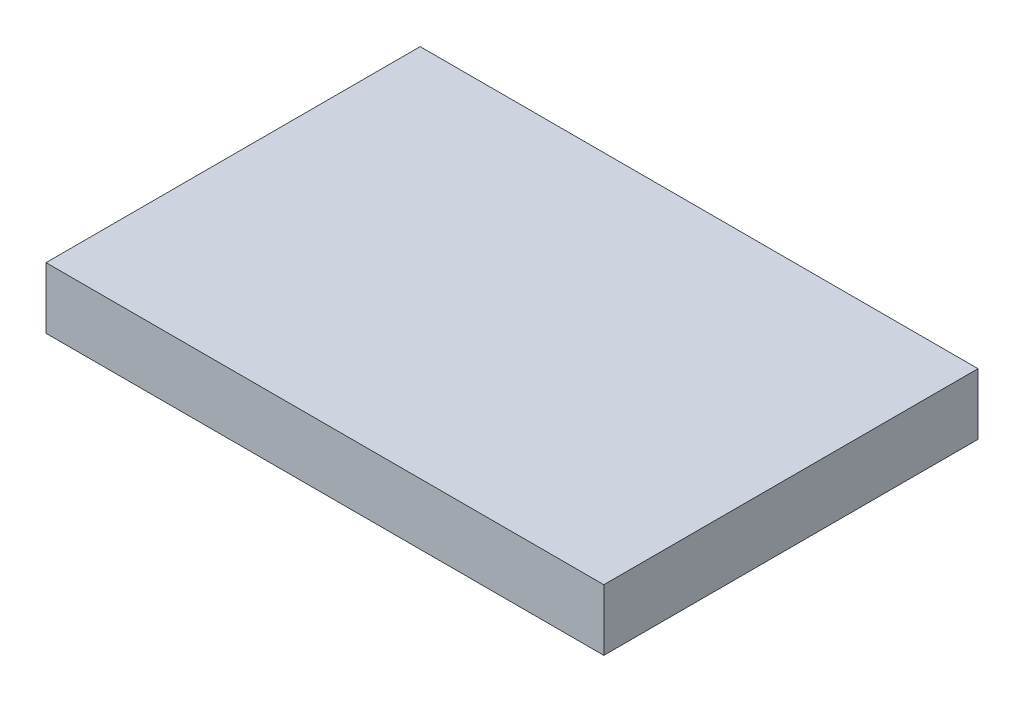
ISO-10303-21;
HEADER;
FILE_DESCRIPTION(('STEP AP214'),'2;1');
FILE_NAME('part.step','',(''),(''),'','','');
FILE_SCHEMA(('AUTOMOTIVE_DESIGN { 1 0 10303 214 1 1 1 1 }'));
ENDSEC;
DATA;
#1=APPLICATION_CONTEXT('core data for automotive mechanical design processes');
#2=APPLICATION_PROTOCOL_DEFINITION('international standard','automotive_design',2000,#1);
#3=PRODUCT_CONTEXT('',#1,'mechanical');
#4=PRODUCT('Part','Part','',(#3));
#5=PRODUCT_RELATED_PRODUCT_CATEGORY('part','',(#4));
#6=PRODUCT_DEFINITION_FORMATION('','',#4);
#7=PRODUCT_DEFINITION_CONTEXT('part definition',#1,'design');
#8=PRODUCT_DEFINITION('design','',#6,#7);
#9=PRODUCT_DEFINITION_SHAPE('','',#8);
#10=(LENGTH_UNIT() NAMED_UNIT(*) SI_UNIT(.MILLI.,.METRE.));
#11=(NAMED_UNIT(*) PLANE_ANGLE_UNIT() SI_UNIT($,.RADIAN.));
#12=(NAMED_UNIT(*) SI_UNIT($,.STERADIAN.) SOLID_ANGLE_UNIT());
#13=UNCERTAINTY_MEASURE_WITH_UNIT(LENGTH_MEASURE(1.E-05),#10,'distance_accuracy_value','');
#14=(GEOMETRIC_REPRESENTATION_CONTEXT(3) GLOBAL_UNCERTAINTY_ASSIGNED_CONTEXT((#13)) GLOBAL_UNIT_ASSIGNED_CONTEXT((#10,
#11,#12)) REPRESENTATION_CONTEXT('',''));
#15=CARTESIAN_POINT('',(0.,0.,0.));
#16=DIRECTION('',(0.,0.,1.));
#17=DIRECTION('',(1.,0.,0.));
#18=AXIS2_PLACEMENT_3D('',#15,#16,#17);
#19=CARTESIAN_POINT('',(-41.,9.,27.5));
#20=DIRECTION('',(-1.,0.,0.));
#21=DIRECTION('',(0.,0.,1.));
#22=AXIS2_PLACEMENT_3D('',#19,#20,#21);
#23=PLANE('',#22);
#24=DIRECTION('',(0.,0.,-1.));
#25=VECTOR('',#24,1.);
#26=CARTESIAN_POINT('',(-41.,0.,27.5));
#27=LINE('',#26,#25);
#28=CARTESIAN_POINT('',(-41.,0.,27.5));
#29=VERTEX_POINT('',#28);
#30=CARTESIAN_POINT('',(-41.,0.,-27.5));
#31=VERTEX_POINT('',#30);
#32=EDGE_CURVE('E108',#29,#31,#27,.T.);
#33=ORIENTED_EDGE('',*,*,#32,.F.);
#34=DIRECTION('',(0.,-1.,0.));
#35=VECTOR('',#34,1.);
#36=CARTESIAN_POINT('',(-41.,9.,27.5));
#37=LINE('',#36,#35);
#38=CARTESIAN_POINT('',(-41.,9.,27.5));
#39=VERTEX_POINT('',#38);
#40=EDGE_CURVE('E11',#39,#29,#37,.T.);
#41=ORIENTED_EDGE('',*,*,#40,.F.);
#42=DIRECTION('',(0.,0.,-1.));
#43=VECTOR('',#42,1.);
#44=CARTESIAN_POINT('',(-41.,9.,27.5));
#45=LINE('',#44,#43);
#46=CARTESIAN_POINT('',(-41.,9.,-27.5));
#47=VERTEX_POINT('',#46);
#48=EDGE_CURVE('E103',#39,#47,#45,.T.);
#49=ORIENTED_EDGE('',*,*,#48,.T.);
#50=DIRECTION('',(0.,-1.,0.));
#51=VECTOR('',#50,1.);
#52=CARTESIAN_POINT('',(-41.,9.,-27.5));
#53=LINE('',#52,#51);
#54=EDGE_CURVE('E46',#47,#31,#53,.T.);
#55=ORIENTED_EDGE('',*,*,#54,.T.);
#56=EDGE_LOOP('',(#33,#41,#49,#55));
#57=FACE_BOUND('',#56,.T.);
#58=ADVANCED_FACE('F43',(#57),#23,.T.);
#59=CARTESIAN_POINT('',(-41.,9.,27.5));
#60=DIRECTION('',(0.,0.,-1.));
#61=DIRECTION('',(-1.,0.,0.));
#62=AXIS2_PLACEMENT_3D('',#59,#60,#61);
#63=PLANE('',#62);
#64=DIRECTION('',(1.,0.,0.));
#65=VECTOR('',#64,1.);
#66=CARTESIAN_POINT('',(-41.,0.,27.5));
#67=LINE('',#66,#65);
#68=CARTESIAN_POINT('',(41.,0.,27.5));
#69=VERTEX_POINT('',#68);
#70=EDGE_CURVE('E76',#29,#69,#67,.T.);
#71=ORIENTED_EDGE('',*,*,#70,.T.);
#72=DIRECTION('',(0.,-1.,0.));
#73=VECTOR('',#72,1.);
#74=CARTESIAN_POINT('',(41.,9.,27.5));
#75=LINE('',#74,#73);
#76=CARTESIAN_POINT('',(41.,9.,27.5));
#77=VERTEX_POINT('',#76);
#78=EDGE_CURVE('E52',#77,#69,#75,.T.);
#79=ORIENTED_EDGE('',*,*,#78,.F.);
#80=DIRECTION('',(1.,0.,0.));
#81=VECTOR('',#80,1.);
#82=CARTESIAN_POINT('',(-41.,9.,27.5));
#83=LINE('',#82,#81);
#84=EDGE_CURVE('E93',#39,#77,#83,.T.);
#85=ORIENTED_EDGE('',*,*,#84,.F.);
#86=ORIENTED_EDGE('',*,*,#40,.T.);
#87=EDGE_LOOP('',(#71,#79,#85,#86));
#88=FACE_BOUND('',#87,.T.);
#89=ADVANCED_FACE('F118',(#88),#63,.F.);
#90=CARTESIAN_POINT('',(41.,9.,27.5));
#91=DIRECTION('',(-1.,0.,0.));
#92=DIRECTION('',(0.,0.,1.));
#93=AXIS2_PLACEMENT_3D('',#90,#91,#92);
#94=PLANE('',#93);
#95=DIRECTION('',(0.,0.,-1.));
#96=VECTOR('',#95,1.);
#97=CARTESIAN_POINT('',(41.,0.,27.5));
#98=LINE('',#97,#96);
#99=CARTESIAN_POINT('',(41.,0.,-27.5));
#100=VERTEX_POINT('',#99);
#101=EDGE_CURVE('E100',#69,#100,#98,.T.);
#102=ORIENTED_EDGE('',*,*,#101,.T.);
#103=DIRECTION('',(0.,-1.,0.));
#104=VECTOR('',#103,1.);
#105=CARTESIAN_POINT('',(41.,9.,-27.5));
#106=LINE('',#105,#104);
#107=CARTESIAN_POINT('',(41.,9.,-27.5));
#108=VERTEX_POINT('',#107);
#109=EDGE_CURVE('E97',#108,#100,#106,.T.);
#110=ORIENTED_EDGE('',*,*,#109,.F.);
#111=DIRECTION('',(0.,0.,-1.));
#112=VECTOR('',#111,1.);
#113=CARTESIAN_POINT('',(41.,9.,27.5));
#114=LINE('',#113,#112);
#115=EDGE_CURVE('E88',#77,#108,#114,.T.);
#116=ORIENTED_EDGE('',*,*,#115,.F.);
#117=ORIENTED_EDGE('',*,*,#78,.T.);
#118=EDGE_LOOP('',(#102,#110,#116,#117));
#119=FACE_BOUND('',#118,.T.);
#120=ADVANCED_FACE('F98',(#119),#94,.F.);
#121=CARTESIAN_POINT('',(-41.,9.,-27.5));
#122=DIRECTION('',(0.,0.,-1.));
#123=DIRECTION('',(-1.,0.,0.));
#124=AXIS2_PLACEMENT_3D('',#121,#122,#123);
#125=PLANE('',#124);
#126=DIRECTION('',(1.,0.,0.));
#127=VECTOR('',#126,1.);
#128=CARTESIAN_POINT('',(-41.,0.,-27.5));
#129=LINE('',#128,#127);
#130=EDGE_CURVE('E111',#31,#100,#129,.T.);
#131=ORIENTED_EDGE('',*,*,#130,.F.);
#132=ORIENTED_EDGE('',*,*,#54,.F.);
#133=DIRECTION('',(1.,0.,0.));
#134=VECTOR('',#133,1.);
#135=CARTESIAN_POINT('',(-41.,9.,-27.5));
#136=LINE('',#135,#134);
#137=EDGE_CURVE('E92',#47,#108,#136,.T.);
#138=ORIENTED_EDGE('',*,*,#137,.T.);
#139=ORIENTED_EDGE('',*,*,#109,.T.);
#140=EDGE_LOOP('',(#131,#132,#138,#139));
#141=FACE_BOUND('',#140,.T.);
#142=ADVANCED_FACE('F102',(#141),#125,.T.);
#143=CARTESIAN_POINT('',(0.,9.,0.));
#144=DIRECTION('',(0.,-1.,0.));
#145=DIRECTION('',(0.,0.,-1.));
#146=AXIS2_PLACEMENT_3D('',#143,#144,#145);
#147=PLANE('',#146);
#148=ORIENTED_EDGE('',*,*,#48,.F.);
#149=ORIENTED_EDGE('',*,*,#84,.T.);
#150=ORIENTED_EDGE('',*,*,#115,.T.);
#151=ORIENTED_EDGE('',*,*,#137,.F.);
#152=EDGE_LOOP('',(#148,#149,#150,#151));
#153=FACE_BOUND('',#152,.T.);
#154=ADVANCED_FACE('F91',(#153),#147,.F.);
#155=CARTESIAN_POINT('',(0.,0.,0.));
#156=DIRECTION('',(0.,-1.,0.));
#157=DIRECTION('',(0.,0.,-1.));
#158=AXIS2_PLACEMENT_3D('',#155,#156,#157);
#159=PLANE('',#158);
#160=ORIENTED_EDGE('',*,*,#32,.T.);
#161=ORIENTED_EDGE('',*,*,#130,.T.);
#162=ORIENTED_EDGE('',*,*,#101,.F.);
#163=ORIENTED_EDGE('',*,*,#70,.F.);
#164=EDGE_LOOP('',(#160,#161,#162,#163));
#165=FACE_BOUND('',#164,.T.);
#166=ADVANCED_FACE('F116',(#165),#159,.T.);
#167=CLOSED_SHELL('',(#58,#89,#120,#142,#154,#166));
#168=MANIFOLD_SOLID_BREP('B2',#167);
#169=ADVANCED_BREP_SHAPE_REPRESENTATION('',(#18,#168),#14);
#170=SHAPE_DEFINITION_REPRESENTATION(#9,#169);
ENDSEC;
END-ISO-10303-21;
